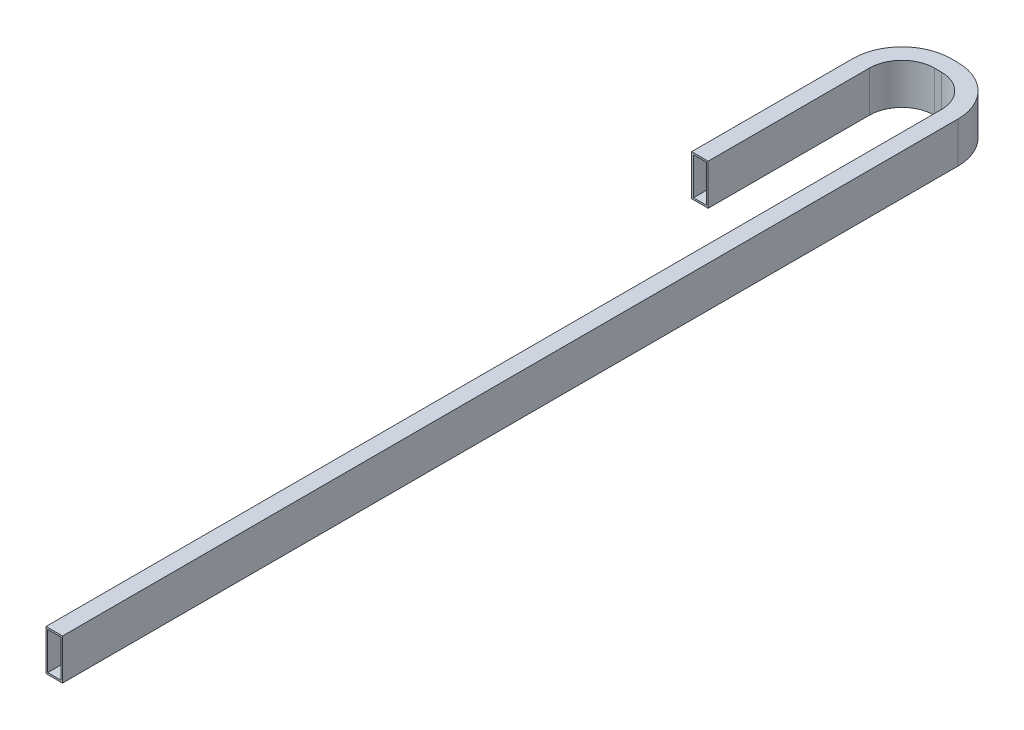
ISO-10303-21;
HEADER;
FILE_DESCRIPTION(('STEP AP214'),'2;1');
FILE_NAME('part.step','',(''),(''),'','','');
FILE_SCHEMA(('AUTOMOTIVE_DESIGN { 1 0 10303 214 1 1 1 1 }'));
ENDSEC;
DATA;
#1=APPLICATION_CONTEXT('core data for automotive mechanical design processes');
#2=APPLICATION_PROTOCOL_DEFINITION('international standard','automotive_design',2000,#1);
#3=PRODUCT_CONTEXT('',#1,'mechanical');
#4=PRODUCT('Part','Part','',(#3));
#5=PRODUCT_RELATED_PRODUCT_CATEGORY('part','',(#4));
#6=PRODUCT_DEFINITION_FORMATION('','',#4);
#7=PRODUCT_DEFINITION_CONTEXT('part definition',#1,'design');
#8=PRODUCT_DEFINITION('design','',#6,#7);
#9=PRODUCT_DEFINITION_SHAPE('','',#8);
#10=(LENGTH_UNIT() NAMED_UNIT(*) SI_UNIT(.MILLI.,.METRE.));
#11=(NAMED_UNIT(*) PLANE_ANGLE_UNIT() SI_UNIT($,.RADIAN.));
#12=(NAMED_UNIT(*) SI_UNIT($,.STERADIAN.) SOLID_ANGLE_UNIT());
#13=UNCERTAINTY_MEASURE_WITH_UNIT(LENGTH_MEASURE(1.E-05),#10,'distance_accuracy_value','');
#14=(GEOMETRIC_REPRESENTATION_CONTEXT(3) GLOBAL_UNCERTAINTY_ASSIGNED_CONTEXT((#13)) GLOBAL_UNIT_ASSIGNED_CONTEXT((#10,
#11,#12)) REPRESENTATION_CONTEXT('',''));
#15=CARTESIAN_POINT('',(0.,0.,0.));
#16=DIRECTION('',(0.,0.,1.));
#17=DIRECTION('',(1.,0.,0.));
#18=AXIS2_PLACEMENT_3D('',#15,#16,#17);
#19=CARTESIAN_POINT('',(6.34999999999999,106.934,-12.7));
#20=DIRECTION('',(-1.,0.,0.));
#21=DIRECTION('',(0.,-1.,0.));
#22=AXIS2_PLACEMENT_3D('',#19,#20,#21);
#23=PLANE('',#22);
#24=DIRECTION('',(0.,-1.,0.));
#25=VECTOR('',#24,1.);
#26=CARTESIAN_POINT('',(6.34999999999999,106.934,0.));
#27=LINE('',#26,#25);
#28=CARTESIAN_POINT('',(6.34999999999999,106.934,0.));
#29=VERTEX_POINT('',#28);
#30=CARTESIAN_POINT('',(6.35,69.8499999999997,0.));
#31=VERTEX_POINT('',#30);
#32=EDGE_CURVE('E378',#29,#31,#27,.T.);
#33=ORIENTED_EDGE('',*,*,#32,.F.);
#34=DIRECTION('',(0.,0.,1.));
#35=VECTOR('',#34,1.);
#36=CARTESIAN_POINT('',(6.34999999999999,106.934,-12.7));
#37=LINE('',#36,#35);
#38=CARTESIAN_POINT('',(6.34999999999999,106.934,-146.513751223267));
#39=VERTEX_POINT('',#38);
#40=EDGE_CURVE('E11',#39,#29,#37,.T.);
#41=ORIENTED_EDGE('',*,*,#40,.F.);
#42=DIRECTION('',(0.,-1.,0.));
#43=VECTOR('',#42,1.);
#44=CARTESIAN_POINT('',(6.34999999999999,106.934,-146.513751223267));
#45=LINE('',#44,#43);
#46=CARTESIAN_POINT('',(6.34999999999999,69.8499999999997,-146.513751223267));
#47=VERTEX_POINT('',#46);
#48=EDGE_CURVE('E331',#39,#47,#45,.T.);
#49=ORIENTED_EDGE('',*,*,#48,.T.);
#50=DIRECTION('',(0.,0.,1.));
#51=VECTOR('',#50,1.);
#52=CARTESIAN_POINT('',(6.35,69.8499999999997,-12.7));
#53=LINE('',#52,#51);
#54=EDGE_CURVE('E35',#47,#31,#53,.T.);
#55=ORIENTED_EDGE('',*,*,#54,.T.);
#56=EDGE_LOOP('',(#33,#41,#49,#55));
#57=FACE_BOUND('',#56,.T.);
#58=ADVANCED_FACE('F32',(#57),#23,.T.);
#59=CARTESIAN_POINT('',(6.34999999999999,106.934,-12.7));
#60=DIRECTION('',(0.,1.,0.));
#61=DIRECTION('',(0.,0.,1.));
#62=AXIS2_PLACEMENT_3D('',#59,#60,#61);
#63=PLANE('',#62);
#64=DIRECTION('',(-1.,0.,0.));
#65=VECTOR('',#64,1.);
#66=CARTESIAN_POINT('',(6.34999999999999,106.934,0.));
#67=LINE('',#66,#65);
#68=CARTESIAN_POINT('',(21.336,106.934,0.));
#69=VERTEX_POINT('',#68);
#70=EDGE_CURVE('E392',#69,#29,#67,.T.);
#71=ORIENTED_EDGE('',*,*,#70,.F.);
#72=DIRECTION('',(0.,0.,1.));
#73=VECTOR('',#72,1.);
#74=CARTESIAN_POINT('',(21.336,106.934,-12.7));
#75=LINE('',#74,#73);
#76=CARTESIAN_POINT('',(21.336,106.934,-146.513751223267));
#77=VERTEX_POINT('',#76);
#78=EDGE_CURVE('E40',#77,#69,#75,.T.);
#79=ORIENTED_EDGE('',*,*,#78,.F.);
#80=CARTESIAN_POINT('',(50.8,106.934,-146.513751223267));
#81=DIRECTION('',(0.,1.,0.));
#82=DIRECTION('',(-1.,0.,0.));
#83=AXIS2_PLACEMENT_3D('',#80,#81,#82);
#84=CIRCLE('',#83,29.464);
#85=CARTESIAN_POINT('',(50.8,106.934,-175.977751223267));
#86=VERTEX_POINT('',#85);
#87=EDGE_CURVE('E347',#86,#77,#84,.T.);
#88=ORIENTED_EDGE('',*,*,#87,.F.);
#89=DIRECTION('',(-1.,0.,0.));
#90=VECTOR('',#89,1.);
#91=CARTESIAN_POINT('',(57.15,106.934,-175.977751223267));
#92=LINE('',#91,#90);
#93=CARTESIAN_POINT('',(57.15,106.934,-175.977751223267));
#94=VERTEX_POINT('',#93);
#95=EDGE_CURVE('E312',#94,#86,#92,.T.);
#96=ORIENTED_EDGE('',*,*,#95,.F.);
#97=CARTESIAN_POINT('',(57.15,106.934,-146.513751223267));
#98=DIRECTION('',(0.,1.,0.));
#99=DIRECTION('',(-1.,0.,0.));
#100=AXIS2_PLACEMENT_3D('',#97,#98,#99);
#101=CIRCLE('',#100,29.464);
#102=CARTESIAN_POINT('',(86.614,106.934,-146.513751223267));
#103=VERTEX_POINT('',#102);
#104=EDGE_CURVE('E277',#103,#94,#101,.T.);
#105=ORIENTED_EDGE('',*,*,#104,.F.);
#106=DIRECTION('',(0.,0.,1.));
#107=VECTOR('',#106,1.);
#108=CARTESIAN_POINT('',(86.614,106.934,-146.513751223267));
#109=LINE('',#108,#107);
#110=CARTESIAN_POINT('',(86.614,106.934,666.75));
#111=VERTEX_POINT('',#110);
#112=EDGE_CURVE('E256',#103,#111,#109,.T.);
#113=ORIENTED_EDGE('',*,*,#112,.T.);
#114=DIRECTION('',(-1.,0.,0.));
#115=VECTOR('',#114,1.);
#116=CARTESIAN_POINT('',(101.6,106.934,666.75));
#117=LINE('',#116,#115);
#118=CARTESIAN_POINT('',(101.6,106.934,666.75));
#119=VERTEX_POINT('',#118);
#120=EDGE_CURVE('E229',#119,#111,#117,.T.);
#121=ORIENTED_EDGE('',*,*,#120,.F.);
#122=DIRECTION('',(0.,0.,1.));
#123=VECTOR('',#122,1.);
#124=CARTESIAN_POINT('',(101.6,106.934,-146.513751223267));
#125=LINE('',#124,#123);
#126=CARTESIAN_POINT('',(101.6,106.934,-146.513751223267));
#127=VERTEX_POINT('',#126);
#128=EDGE_CURVE('E247',#127,#119,#125,.T.);
#129=ORIENTED_EDGE('',*,*,#128,.F.);
#130=CARTESIAN_POINT('',(57.15,106.934,-146.513751223267));
#131=DIRECTION('',(0.,1.,0.));
#132=DIRECTION('',(-1.,0.,0.));
#133=AXIS2_PLACEMENT_3D('',#130,#131,#132);
#134=CIRCLE('',#133,44.45);
#135=CARTESIAN_POINT('',(57.15,106.934,-190.963751223267));
#136=VERTEX_POINT('',#135);
#137=EDGE_CURVE('E266',#127,#136,#134,.T.);
#138=ORIENTED_EDGE('',*,*,#137,.T.);
#139=DIRECTION('',(-1.,0.,0.));
#140=VECTOR('',#139,1.);
#141=CARTESIAN_POINT('',(57.15,106.934,-190.963751223267));
#142=LINE('',#141,#140);
#143=CARTESIAN_POINT('',(50.8,106.934,-190.963751223267));
#144=VERTEX_POINT('',#143);
#145=EDGE_CURVE('E301',#136,#144,#142,.T.);
#146=ORIENTED_EDGE('',*,*,#145,.T.);
#147=CARTESIAN_POINT('',(50.8,106.934,-146.513751223267));
#148=DIRECTION('',(0.,1.,0.));
#149=DIRECTION('',(-1.,0.,0.));
#150=AXIS2_PLACEMENT_3D('',#147,#148,#149);
#151=CIRCLE('',#150,44.45);
#152=EDGE_CURVE('E337',#144,#39,#151,.T.);
#153=ORIENTED_EDGE('',*,*,#152,.T.);
#154=ORIENTED_EDGE('',*,*,#40,.T.);
#155=EDGE_LOOP('',(#71,#79,#88,#96,#105,#113,#121,#129,#138,#146,#153,#154));
#156=FACE_BOUND('',#155,.T.);
#157=ADVANCED_FACE('F404',(#156),#63,.T.);
#158=CARTESIAN_POINT('',(21.336,106.934,-12.7));
#159=DIRECTION('',(1.,0.,0.));
#160=DIRECTION('',(0.,1.,0.));
#161=AXIS2_PLACEMENT_3D('',#158,#159,#160);
#162=PLANE('',#161);
#163=DIRECTION('',(0.,1.,0.));
#164=VECTOR('',#163,1.);
#165=CARTESIAN_POINT('',(21.336,106.934,0.));
#166=LINE('',#165,#164);
#167=CARTESIAN_POINT('',(21.336,69.8499999999997,0.));
#168=VERTEX_POINT('',#167);
#169=EDGE_CURVE('E389',#168,#69,#166,.T.);
#170=ORIENTED_EDGE('',*,*,#169,.F.);
#171=DIRECTION('',(0.,0.,1.));
#172=VECTOR('',#171,1.);
#173=CARTESIAN_POINT('',(21.336,69.8499999999997,-12.7));
#174=LINE('',#173,#172);
#175=CARTESIAN_POINT('',(21.336,69.8499999999997,-146.513751223267));
#176=VERTEX_POINT('',#175);
#177=EDGE_CURVE('E395',#176,#168,#174,.T.);
#178=ORIENTED_EDGE('',*,*,#177,.F.);
#179=DIRECTION('',(0.,1.,0.));
#180=VECTOR('',#179,1.);
#181=CARTESIAN_POINT('',(21.336,69.8499999999997,-146.513751223267));
#182=LINE('',#181,#180);
#183=EDGE_CURVE('E334',#176,#77,#182,.T.);
#184=ORIENTED_EDGE('',*,*,#183,.T.);
#185=ORIENTED_EDGE('',*,*,#78,.T.);
#186=EDGE_LOOP('',(#170,#178,#184,#185));
#187=FACE_BOUND('',#186,.T.);
#188=ADVANCED_FACE('F407',(#187),#162,.T.);
#189=CARTESIAN_POINT('',(6.35,69.8499999999997,-12.7));
#190=DIRECTION('',(0.,-1.,0.));
#191=DIRECTION('',(0.,0.,-1.));
#192=AXIS2_PLACEMENT_3D('',#189,#190,#191);
#193=PLANE('',#192);
#194=DIRECTION('',(1.,0.,0.));
#195=VECTOR('',#194,1.);
#196=CARTESIAN_POINT('',(6.35,69.8499999999997,0.));
#197=LINE('',#196,#195);
#198=EDGE_CURVE('E386',#31,#168,#197,.T.);
#199=ORIENTED_EDGE('',*,*,#198,.F.);
#200=ORIENTED_EDGE('',*,*,#54,.F.);
#201=CARTESIAN_POINT('',(50.8,69.8499999999997,-146.513751223267));
#202=DIRECTION('',(0.,1.,0.));
#203=DIRECTION('',(-1.,0.,0.));
#204=AXIS2_PLACEMENT_3D('',#201,#202,#203);
#205=CIRCLE('',#204,44.45);
#206=CARTESIAN_POINT('',(50.8,69.8499999999997,-190.963751223267));
#207=VERTEX_POINT('',#206);
#208=EDGE_CURVE('E342',#207,#47,#205,.T.);
#209=ORIENTED_EDGE('',*,*,#208,.F.);
#210=DIRECTION('',(-1.,0.,0.));
#211=VECTOR('',#210,1.);
#212=CARTESIAN_POINT('',(57.15,69.8499999999997,-190.963751223267));
#213=LINE('',#212,#211);
#214=CARTESIAN_POINT('',(57.15,69.8499999999997,-190.963751223267));
#215=VERTEX_POINT('',#214);
#216=EDGE_CURVE('E306',#215,#207,#213,.T.);
#217=ORIENTED_EDGE('',*,*,#216,.F.);
#218=CARTESIAN_POINT('',(57.15,69.8499999999997,-146.513751223267));
#219=DIRECTION('',(0.,1.,0.));
#220=DIRECTION('',(-1.,0.,0.));
#221=AXIS2_PLACEMENT_3D('',#218,#219,#220);
#222=CIRCLE('',#221,44.45);
#223=CARTESIAN_POINT('',(101.6,69.8499999999997,-146.513751223267));
#224=VERTEX_POINT('',#223);
#225=EDGE_CURVE('E271',#224,#215,#222,.T.);
#226=ORIENTED_EDGE('',*,*,#225,.F.);
#227=DIRECTION('',(0.,0.,1.));
#228=VECTOR('',#227,1.);
#229=CARTESIAN_POINT('',(101.6,69.8499999999997,-146.513751223267));
#230=LINE('',#229,#228);
#231=CARTESIAN_POINT('',(101.6,69.8499999999997,666.75));
#232=VERTEX_POINT('',#231);
#233=EDGE_CURVE('E206',#224,#232,#230,.T.);
#234=ORIENTED_EDGE('',*,*,#233,.T.);
#235=DIRECTION('',(1.,0.,0.));
#236=VECTOR('',#235,1.);
#237=CARTESIAN_POINT('',(101.6,69.8499999999997,666.75));
#238=LINE('',#237,#236);
#239=CARTESIAN_POINT('',(86.614,69.8499999999997,666.75));
#240=VERTEX_POINT('',#239);
#241=EDGE_CURVE('E235',#240,#232,#238,.T.);
#242=ORIENTED_EDGE('',*,*,#241,.F.);
#243=DIRECTION('',(0.,0.,1.));
#244=VECTOR('',#243,1.);
#245=CARTESIAN_POINT('',(86.614,69.8499999999997,-146.513751223267));
#246=LINE('',#245,#244);
#247=CARTESIAN_POINT('',(86.614,69.8499999999997,-146.513751223267));
#248=VERTEX_POINT('',#247);
#249=EDGE_CURVE('E258',#248,#240,#246,.T.);
#250=ORIENTED_EDGE('',*,*,#249,.F.);
#251=CARTESIAN_POINT('',(57.15,69.8499999999997,-146.513751223267));
#252=DIRECTION('',(0.,1.,0.));
#253=DIRECTION('',(-1.,0.,0.));
#254=AXIS2_PLACEMENT_3D('',#251,#252,#253);
#255=CIRCLE('',#254,29.464);
#256=CARTESIAN_POINT('',(57.15,69.8499999999997,-175.977751223267));
#257=VERTEX_POINT('',#256);
#258=EDGE_CURVE('E280',#248,#257,#255,.T.);
#259=ORIENTED_EDGE('',*,*,#258,.T.);
#260=DIRECTION('',(-1.,0.,0.));
#261=VECTOR('',#260,1.);
#262=CARTESIAN_POINT('',(57.15,69.8499999999997,-175.977751223267));
#263=LINE('',#262,#261);
#264=CARTESIAN_POINT('',(50.8,69.8499999999997,-175.977751223267));
#265=VERTEX_POINT('',#264);
#266=EDGE_CURVE('E315',#257,#265,#263,.T.);
#267=ORIENTED_EDGE('',*,*,#266,.T.);
#268=CARTESIAN_POINT('',(50.8,69.8499999999997,-146.513751223267));
#269=DIRECTION('',(0.,1.,0.));
#270=DIRECTION('',(-1.,0.,0.));
#271=AXIS2_PLACEMENT_3D('',#268,#269,#270);
#272=CIRCLE('',#271,29.464);
#273=EDGE_CURVE('E350',#265,#176,#272,.T.);
#274=ORIENTED_EDGE('',*,*,#273,.T.);
#275=ORIENTED_EDGE('',*,*,#177,.T.);
#276=EDGE_LOOP('',(#199,#200,#209,#217,#226,#234,#242,#250,#259,#267,#274,#275));
#277=FACE_BOUND('',#276,.T.);
#278=ADVANCED_FACE('F401',(#277),#193,.T.);
#279=CARTESIAN_POINT('',(6.35,69.8499999999997,0.));
#280=DIRECTION('',(0.,0.,1.));
#281=DIRECTION('',(1.,0.,0.));
#282=AXIS2_PLACEMENT_3D('',#279,#280,#281);
#283=PLANE('',#282);
#284=DIRECTION('',(0.,-1.,0.));
#285=VECTOR('',#284,1.);
#286=CARTESIAN_POINT('',(7.93749999999999,105.3465,0.));
#287=LINE('',#286,#285);
#288=CARTESIAN_POINT('',(7.93749999999999,105.3465,0.));
#289=VERTEX_POINT('',#288);
#290=CARTESIAN_POINT('',(7.9375,71.4374999999997,0.));
#291=VERTEX_POINT('',#290);
#292=EDGE_CURVE('E48',#289,#291,#287,.T.);
#293=ORIENTED_EDGE('',*,*,#292,.F.);
#294=DIRECTION('',(-1.,0.,0.));
#295=VECTOR('',#294,1.);
#296=CARTESIAN_POINT('',(7.93749999999999,105.3465,0.));
#297=LINE('',#296,#295);
#298=CARTESIAN_POINT('',(19.7485,105.3465,0.));
#299=VERTEX_POINT('',#298);
#300=EDGE_CURVE('E373',#299,#289,#297,.T.);
#301=ORIENTED_EDGE('',*,*,#300,.F.);
#302=DIRECTION('',(0.,1.,0.));
#303=VECTOR('',#302,1.);
#304=CARTESIAN_POINT('',(19.7485,105.3465,0.));
#305=LINE('',#304,#303);
#306=CARTESIAN_POINT('',(19.7485,71.4374999999997,0.));
#307=VERTEX_POINT('',#306);
#308=EDGE_CURVE('E370',#307,#299,#305,.T.);
#309=ORIENTED_EDGE('',*,*,#308,.F.);
#310=DIRECTION('',(1.,0.,0.));
#311=VECTOR('',#310,1.);
#312=CARTESIAN_POINT('',(7.9375,71.4374999999997,0.));
#313=LINE('',#312,#311);
#314=EDGE_CURVE('E367',#291,#307,#313,.T.);
#315=ORIENTED_EDGE('',*,*,#314,.F.);
#316=EDGE_LOOP('',(#293,#301,#309,#315));
#317=FACE_BOUND('',#316,.T.);
#318=ORIENTED_EDGE('',*,*,#32,.T.);
#319=ORIENTED_EDGE('',*,*,#198,.T.);
#320=ORIENTED_EDGE('',*,*,#169,.T.);
#321=ORIENTED_EDGE('',*,*,#70,.T.);
#322=EDGE_LOOP('',(#318,#319,#320,#321));
#323=FACE_BOUND('',#322,.T.);
#324=ADVANCED_FACE('F403',(#317,#323),#283,.T.);
#325=CARTESIAN_POINT('',(7.93749999999999,105.3465,-12.7));
#326=DIRECTION('',(-1.,0.,0.));
#327=DIRECTION('',(0.,-1.,0.));
#328=AXIS2_PLACEMENT_3D('',#325,#326,#327);
#329=PLANE('',#328);
#330=ORIENTED_EDGE('',*,*,#292,.T.);
#331=DIRECTION('',(0.,0.,1.));
#332=VECTOR('',#331,1.);
#333=CARTESIAN_POINT('',(7.9375,71.4374999999997,-12.7));
#334=LINE('',#333,#332);
#335=CARTESIAN_POINT('',(7.93750000000001,71.4374999999997,-146.513751223267));
#336=VERTEX_POINT('',#335);
#337=EDGE_CURVE('E375',#336,#291,#334,.T.);
#338=ORIENTED_EDGE('',*,*,#337,.F.);
#339=DIRECTION('',(0.,-1.,0.));
#340=VECTOR('',#339,1.);
#341=CARTESIAN_POINT('',(7.93750000000001,105.3465,-146.513751223267));
#342=LINE('',#341,#340);
#343=CARTESIAN_POINT('',(7.93750000000001,105.3465,-146.513751223267));
#344=VERTEX_POINT('',#343);
#345=EDGE_CURVE('E341',#344,#336,#342,.T.);
#346=ORIENTED_EDGE('',*,*,#345,.F.);
#347=DIRECTION('',(0.,0.,1.));
#348=VECTOR('',#347,1.);
#349=CARTESIAN_POINT('',(7.93749999999999,105.3465,-12.7));
#350=LINE('',#349,#348);
#351=EDGE_CURVE('E376',#344,#289,#350,.T.);
#352=ORIENTED_EDGE('',*,*,#351,.T.);
#353=EDGE_LOOP('',(#330,#338,#346,#352));
#354=FACE_BOUND('',#353,.T.);
#355=ADVANCED_FACE('F465',(#354),#329,.F.);
#356=CARTESIAN_POINT('',(7.93749999999999,105.3465,-12.7));
#357=DIRECTION('',(0.,1.,0.));
#358=DIRECTION('',(0.,0.,1.));
#359=AXIS2_PLACEMENT_3D('',#356,#357,#358);
#360=PLANE('',#359);
#361=ORIENTED_EDGE('',*,*,#300,.T.);
#362=ORIENTED_EDGE('',*,*,#351,.F.);
#363=CARTESIAN_POINT('',(50.8,105.3465,-146.513751223267));
#364=DIRECTION('',(0.,1.,0.));
#365=DIRECTION('',(-1.,0.,0.));
#366=AXIS2_PLACEMENT_3D('',#363,#364,#365);
#367=CIRCLE('',#366,42.8625);
#368=CARTESIAN_POINT('',(50.8,105.3465,-189.376251223267));
#369=VERTEX_POINT('',#368);
#370=EDGE_CURVE('E357',#369,#344,#367,.T.);
#371=ORIENTED_EDGE('',*,*,#370,.F.);
#372=DIRECTION('',(-1.,0.,0.));
#373=VECTOR('',#372,1.);
#374=CARTESIAN_POINT('',(57.15,105.3465,-189.376251223267));
#375=LINE('',#374,#373);
#376=CARTESIAN_POINT('',(57.15,105.3465,-189.376251223267));
#377=VERTEX_POINT('',#376);
#378=EDGE_CURVE('E322',#377,#369,#375,.T.);
#379=ORIENTED_EDGE('',*,*,#378,.F.);
#380=CARTESIAN_POINT('',(57.15,105.3465,-146.513751223267));
#381=DIRECTION('',(0.,1.,0.));
#382=DIRECTION('',(-1.,0.,0.));
#383=AXIS2_PLACEMENT_3D('',#380,#381,#382);
#384=CIRCLE('',#383,42.8625);
#385=CARTESIAN_POINT('',(100.0125,105.3465,-146.513751223267));
#386=VERTEX_POINT('',#385);
#387=EDGE_CURVE('E286',#386,#377,#384,.T.);
#388=ORIENTED_EDGE('',*,*,#387,.F.);
#389=DIRECTION('',(0.,0.,1.));
#390=VECTOR('',#389,1.);
#391=CARTESIAN_POINT('',(100.0125,105.3465,-146.513751223267));
#392=LINE('',#391,#390);
#393=CARTESIAN_POINT('',(100.0125,105.3465,666.75));
#394=VERTEX_POINT('',#393);
#395=EDGE_CURVE('E205',#386,#394,#392,.T.);
#396=ORIENTED_EDGE('',*,*,#395,.T.);
#397=DIRECTION('',(-1.,0.,0.));
#398=VECTOR('',#397,1.);
#399=CARTESIAN_POINT('',(100.0125,105.3465,666.75));
#400=LINE('',#399,#398);
#401=CARTESIAN_POINT('',(88.2015,105.3465,666.75));
#402=VERTEX_POINT('',#401);
#403=EDGE_CURVE('E209',#394,#402,#400,.T.);
#404=ORIENTED_EDGE('',*,*,#403,.T.);
#405=DIRECTION('',(0.,0.,1.));
#406=VECTOR('',#405,1.);
#407=CARTESIAN_POINT('',(88.2015,105.3465,-146.513751223267));
#408=LINE('',#407,#406);
#409=CARTESIAN_POINT('',(88.2015,105.3465,-146.513751223267));
#410=VERTEX_POINT('',#409);
#411=EDGE_CURVE('E194',#410,#402,#408,.T.);
#412=ORIENTED_EDGE('',*,*,#411,.F.);
#413=CARTESIAN_POINT('',(57.15,105.3465,-146.513751223267));
#414=DIRECTION('',(0.,1.,0.));
#415=DIRECTION('',(-1.,0.,0.));
#416=AXIS2_PLACEMENT_3D('',#413,#414,#415);
#417=CIRCLE('',#416,31.0515);
#418=CARTESIAN_POINT('',(57.15,105.3465,-177.565251223267));
#419=VERTEX_POINT('',#418);
#420=EDGE_CURVE('E274',#410,#419,#417,.T.);
#421=ORIENTED_EDGE('',*,*,#420,.T.);
#422=DIRECTION('',(-1.,0.,0.));
#423=VECTOR('',#422,1.);
#424=CARTESIAN_POINT('',(57.15,105.3465,-177.565251223267));
#425=LINE('',#424,#423);
#426=CARTESIAN_POINT('',(50.8,105.3465,-177.565251223267));
#427=VERTEX_POINT('',#426);
#428=EDGE_CURVE('E309',#419,#427,#425,.T.);
#429=ORIENTED_EDGE('',*,*,#428,.T.);
#430=CARTESIAN_POINT('',(50.8,105.3465,-146.513751223267));
#431=DIRECTION('',(0.,1.,0.));
#432=DIRECTION('',(-1.,0.,0.));
#433=AXIS2_PLACEMENT_3D('',#430,#431,#432);
#434=CIRCLE('',#433,31.0515);
#435=CARTESIAN_POINT('',(19.7485,105.3465,-146.513751223267));
#436=VERTEX_POINT('',#435);
#437=EDGE_CURVE('E345',#427,#436,#434,.T.);
#438=ORIENTED_EDGE('',*,*,#437,.T.);
#439=DIRECTION('',(0.,0.,1.));
#440=VECTOR('',#439,1.);
#441=CARTESIAN_POINT('',(19.7485,105.3465,-12.7));
#442=LINE('',#441,#440);
#443=EDGE_CURVE('E379',#436,#299,#442,.T.);
#444=ORIENTED_EDGE('',*,*,#443,.T.);
#445=EDGE_LOOP('',(#361,#362,#371,#379,#388,#396,#404,#412,#421,#429,#438,#444));
#446=FACE_BOUND('',#445,.T.);
#447=ADVANCED_FACE('F211',(#446),#360,.F.);
#448=CARTESIAN_POINT('',(19.7485,105.3465,-12.7));
#449=DIRECTION('',(1.,0.,0.));
#450=DIRECTION('',(0.,1.,0.));
#451=AXIS2_PLACEMENT_3D('',#448,#449,#450);
#452=PLANE('',#451);
#453=ORIENTED_EDGE('',*,*,#308,.T.);
#454=ORIENTED_EDGE('',*,*,#443,.F.);
#455=DIRECTION('',(0.,1.,0.));
#456=VECTOR('',#455,1.);
#457=CARTESIAN_POINT('',(19.7485,71.4374999999997,-146.513751223267));
#458=LINE('',#457,#456);
#459=CARTESIAN_POINT('',(19.7485,71.4374999999997,-146.513751223267));
#460=VERTEX_POINT('',#459);
#461=EDGE_CURVE('E338',#460,#436,#458,.T.);
#462=ORIENTED_EDGE('',*,*,#461,.F.);
#463=DIRECTION('',(0.,0.,1.));
#464=VECTOR('',#463,1.);
#465=CARTESIAN_POINT('',(19.7485,71.4374999999997,-12.7));
#466=LINE('',#465,#464);
#467=EDGE_CURVE('E381',#460,#307,#466,.T.);
#468=ORIENTED_EDGE('',*,*,#467,.T.);
#469=EDGE_LOOP('',(#453,#454,#462,#468));
#470=FACE_BOUND('',#469,.T.);
#471=ADVANCED_FACE('F482',(#470),#452,.F.);
#472=CARTESIAN_POINT('',(7.9375,71.4374999999997,-12.7));
#473=DIRECTION('',(0.,-1.,0.));
#474=DIRECTION('',(0.,0.,-1.));
#475=AXIS2_PLACEMENT_3D('',#472,#473,#474);
#476=PLANE('',#475);
#477=ORIENTED_EDGE('',*,*,#314,.T.);
#478=ORIENTED_EDGE('',*,*,#467,.F.);
#479=CARTESIAN_POINT('',(50.8,71.4374999999997,-146.513751223267));
#480=DIRECTION('',(0.,1.,0.));
#481=DIRECTION('',(-1.,0.,0.));
#482=AXIS2_PLACEMENT_3D('',#479,#480,#481);
#483=CIRCLE('',#482,31.0515);
#484=CARTESIAN_POINT('',(50.8,71.4374999999997,-177.565251223267));
#485=VERTEX_POINT('',#484);
#486=EDGE_CURVE('E363',#485,#460,#483,.T.);
#487=ORIENTED_EDGE('',*,*,#486,.F.);
#488=DIRECTION('',(-1.,0.,0.));
#489=VECTOR('',#488,1.);
#490=CARTESIAN_POINT('',(57.15,71.4374999999997,-177.565251223267));
#491=LINE('',#490,#489);
#492=CARTESIAN_POINT('',(57.15,71.4374999999997,-177.565251223267));
#493=VERTEX_POINT('',#492);
#494=EDGE_CURVE('E328',#493,#485,#491,.T.);
#495=ORIENTED_EDGE('',*,*,#494,.F.);
#496=CARTESIAN_POINT('',(57.15,71.4374999999997,-146.513751223267));
#497=DIRECTION('',(0.,1.,0.));
#498=DIRECTION('',(-1.,0.,0.));
#499=AXIS2_PLACEMENT_3D('',#496,#497,#498);
#500=CIRCLE('',#499,31.0515);
#501=CARTESIAN_POINT('',(88.2015,71.4374999999997,-146.513751223267));
#502=VERTEX_POINT('',#501);
#503=EDGE_CURVE('E292',#502,#493,#500,.T.);
#504=ORIENTED_EDGE('',*,*,#503,.F.);
#505=DIRECTION('',(0.,0.,1.));
#506=VECTOR('',#505,1.);
#507=CARTESIAN_POINT('',(88.2015,71.4374999999997,-146.513751223267));
#508=LINE('',#507,#506);
#509=CARTESIAN_POINT('',(88.2015,71.4374999999997,666.75));
#510=VERTEX_POINT('',#509);
#511=EDGE_CURVE('E252',#502,#510,#508,.T.);
#512=ORIENTED_EDGE('',*,*,#511,.T.);
#513=DIRECTION('',(1.,0.,0.));
#514=VECTOR('',#513,1.);
#515=CARTESIAN_POINT('',(100.0125,71.4374999999997,666.75));
#516=LINE('',#515,#514);
#517=CARTESIAN_POINT('',(100.0125,71.4374999999997,666.75));
#518=VERTEX_POINT('',#517);
#519=EDGE_CURVE('E221',#510,#518,#516,.T.);
#520=ORIENTED_EDGE('',*,*,#519,.T.);
#521=DIRECTION('',(0.,0.,1.));
#522=VECTOR('',#521,1.);
#523=CARTESIAN_POINT('',(100.0125,71.4374999999997,-146.513751223267));
#524=LINE('',#523,#522);
#525=CARTESIAN_POINT('',(100.0125,71.4374999999997,-146.513751223267));
#526=VERTEX_POINT('',#525);
#527=EDGE_CURVE('E250',#526,#518,#524,.T.);
#528=ORIENTED_EDGE('',*,*,#527,.F.);
#529=CARTESIAN_POINT('',(57.15,71.4374999999997,-146.513751223267));
#530=DIRECTION('',(0.,1.,0.));
#531=DIRECTION('',(-1.,0.,0.));
#532=AXIS2_PLACEMENT_3D('',#529,#530,#531);
#533=CIRCLE('',#532,42.8625);
#534=CARTESIAN_POINT('',(57.15,71.4374999999997,-189.376251223267));
#535=VERTEX_POINT('',#534);
#536=EDGE_CURVE('E289',#526,#535,#533,.T.);
#537=ORIENTED_EDGE('',*,*,#536,.T.);
#538=DIRECTION('',(-1.,0.,0.));
#539=VECTOR('',#538,1.);
#540=CARTESIAN_POINT('',(57.15,71.4374999999997,-189.376251223267));
#541=LINE('',#540,#539);
#542=CARTESIAN_POINT('',(50.8,71.4374999999997,-189.376251223267));
#543=VERTEX_POINT('',#542);
#544=EDGE_CURVE('E325',#535,#543,#541,.T.);
#545=ORIENTED_EDGE('',*,*,#544,.T.);
#546=CARTESIAN_POINT('',(50.8,71.4374999999997,-146.513751223267));
#547=DIRECTION('',(0.,1.,0.));
#548=DIRECTION('',(-1.,0.,0.));
#549=AXIS2_PLACEMENT_3D('',#546,#547,#548);
#550=CIRCLE('',#549,42.8625);
#551=EDGE_CURVE('E360',#543,#336,#550,.T.);
#552=ORIENTED_EDGE('',*,*,#551,.T.);
#553=ORIENTED_EDGE('',*,*,#337,.T.);
#554=EDGE_LOOP('',(#477,#478,#487,#495,#504,#512,#520,#528,#537,#545,#552,#553));
#555=FACE_BOUND('',#554,.T.);
#556=ADVANCED_FACE('F474',(#555),#476,.F.);
#557=CARTESIAN_POINT('',(50.8,69.8499999999997,-146.513751223267));
#558=DIRECTION('',(0.,1.,0.));
#559=DIRECTION('',(-1.,0.,0.));
#560=AXIS2_PLACEMENT_3D('',#557,#558,#559);
#561=CYLINDRICAL_SURFACE('',#560,42.8625);
#562=DIRECTION('',(0.,-1.,0.));
#563=VECTOR('',#562,1.);
#564=CARTESIAN_POINT('',(50.8,105.3465,-189.376251223267));
#565=LINE('',#564,#563);
#566=EDGE_CURVE('E305',#369,#543,#565,.T.);
#567=ORIENTED_EDGE('',*,*,#566,.F.);
#568=ORIENTED_EDGE('',*,*,#370,.T.);
#569=ORIENTED_EDGE('',*,*,#345,.T.);
#570=ORIENTED_EDGE('',*,*,#551,.F.);
#571=EDGE_LOOP('',(#567,#568,#569,#570));
#572=FACE_BOUND('',#571,.T.);
#573=ADVANCED_FACE('F479',(#572),#561,.F.);
#574=CARTESIAN_POINT('',(50.8,69.8499999999997,-146.513751223267));
#575=DIRECTION('',(0.,1.,0.));
#576=DIRECTION('',(-1.,0.,0.));
#577=AXIS2_PLACEMENT_3D('',#574,#575,#576);
#578=CYLINDRICAL_SURFACE('',#577,31.0515);
#579=DIRECTION('',(0.,1.,0.));
#580=VECTOR('',#579,1.);
#581=CARTESIAN_POINT('',(50.8,71.4374999999997,-177.565251223267));
#582=LINE('',#581,#580);
#583=EDGE_CURVE('E302',#485,#427,#582,.T.);
#584=ORIENTED_EDGE('',*,*,#583,.F.);
#585=ORIENTED_EDGE('',*,*,#486,.T.);
#586=ORIENTED_EDGE('',*,*,#461,.T.);
#587=ORIENTED_EDGE('',*,*,#437,.F.);
#588=EDGE_LOOP('',(#584,#585,#586,#587));
#589=FACE_BOUND('',#588,.T.);
#590=ADVANCED_FACE('F448',(#589),#578,.T.);
#591=CARTESIAN_POINT('',(50.8,69.8499999999997,-146.513751223267));
#592=DIRECTION('',(0.,1.,0.));
#593=DIRECTION('',(-1.,0.,0.));
#594=AXIS2_PLACEMENT_3D('',#591,#592,#593);
#595=CYLINDRICAL_SURFACE('',#594,29.464);
#596=DIRECTION('',(0.,1.,0.));
#597=VECTOR('',#596,1.);
#598=CARTESIAN_POINT('',(50.8,69.8499999999997,-175.977751223267));
#599=LINE('',#598,#597);
#600=EDGE_CURVE('E298',#265,#86,#599,.T.);
#601=ORIENTED_EDGE('',*,*,#600,.T.);
#602=ORIENTED_EDGE('',*,*,#87,.T.);
#603=ORIENTED_EDGE('',*,*,#183,.F.);
#604=ORIENTED_EDGE('',*,*,#273,.F.);
#605=EDGE_LOOP('',(#601,#602,#603,#604));
#606=FACE_BOUND('',#605,.T.);
#607=ADVANCED_FACE('F409',(#606),#595,.F.);
#608=CARTESIAN_POINT('',(50.8,69.8499999999997,-146.513751223267));
#609=DIRECTION('',(0.,1.,0.));
#610=DIRECTION('',(-1.,0.,0.));
#611=AXIS2_PLACEMENT_3D('',#608,#609,#610);
#612=CYLINDRICAL_SURFACE('',#611,44.45);
#613=DIRECTION('',(0.,-1.,0.));
#614=VECTOR('',#613,1.);
#615=CARTESIAN_POINT('',(50.8,106.934,-190.963751223267));
#616=LINE('',#615,#614);
#617=EDGE_CURVE('E295',#144,#207,#616,.T.);
#618=ORIENTED_EDGE('',*,*,#617,.T.);
#619=ORIENTED_EDGE('',*,*,#208,.T.);
#620=ORIENTED_EDGE('',*,*,#48,.F.);
#621=ORIENTED_EDGE('',*,*,#152,.F.);
#622=EDGE_LOOP('',(#618,#619,#620,#621));
#623=FACE_BOUND('',#622,.T.);
#624=ADVANCED_FACE('F437',(#623),#612,.T.);
#625=CARTESIAN_POINT('',(57.15,105.3465,-189.376251223267));
#626=DIRECTION('',(0.,0.,-1.));
#627=DIRECTION('',(0.,1.,0.));
#628=AXIS2_PLACEMENT_3D('',#625,#626,#627);
#629=PLANE('',#628);
#630=DIRECTION('',(0.,-1.,0.));
#631=VECTOR('',#630,1.);
#632=CARTESIAN_POINT('',(57.15,105.3465,-189.376251223267));
#633=LINE('',#632,#631);
#634=EDGE_CURVE('E270',#377,#535,#633,.T.);
#635=ORIENTED_EDGE('',*,*,#634,.F.);
#636=ORIENTED_EDGE('',*,*,#378,.T.);
#637=ORIENTED_EDGE('',*,*,#566,.T.);
#638=ORIENTED_EDGE('',*,*,#544,.F.);
#639=EDGE_LOOP('',(#635,#636,#637,#638));
#640=FACE_BOUND('',#639,.T.);
#641=ADVANCED_FACE('F439',(#640),#629,.F.);
#642=CARTESIAN_POINT('',(57.15,71.4374999999997,-177.565251223267));
#643=DIRECTION('',(0.,0.,1.));
#644=DIRECTION('',(0.,-1.,0.));
#645=AXIS2_PLACEMENT_3D('',#642,#643,#644);
#646=PLANE('',#645);
#647=DIRECTION('',(0.,1.,0.));
#648=VECTOR('',#647,1.);
#649=CARTESIAN_POINT('',(57.15,71.4374999999997,-177.565251223267));
#650=LINE('',#649,#648);
#651=EDGE_CURVE('E267',#493,#419,#650,.T.);
#652=ORIENTED_EDGE('',*,*,#651,.F.);
#653=ORIENTED_EDGE('',*,*,#494,.T.);
#654=ORIENTED_EDGE('',*,*,#583,.T.);
#655=ORIENTED_EDGE('',*,*,#428,.F.);
#656=EDGE_LOOP('',(#652,#653,#654,#655));
#657=FACE_BOUND('',#656,.T.);
#658=ADVANCED_FACE('F445',(#657),#646,.F.);
#659=CARTESIAN_POINT('',(57.15,69.8499999999997,-175.977751223267));
#660=DIRECTION('',(0.,0.,1.));
#661=DIRECTION('',(0.,-1.,0.));
#662=AXIS2_PLACEMENT_3D('',#659,#660,#661);
#663=PLANE('',#662);
#664=DIRECTION('',(0.,1.,0.));
#665=VECTOR('',#664,1.);
#666=CARTESIAN_POINT('',(57.15,69.8499999999997,-175.977751223267));
#667=LINE('',#666,#665);
#668=EDGE_CURVE('E263',#257,#94,#667,.T.);
#669=ORIENTED_EDGE('',*,*,#668,.T.);
#670=ORIENTED_EDGE('',*,*,#95,.T.);
#671=ORIENTED_EDGE('',*,*,#600,.F.);
#672=ORIENTED_EDGE('',*,*,#266,.F.);
#673=EDGE_LOOP('',(#669,#670,#671,#672));
#674=FACE_BOUND('',#673,.T.);
#675=ADVANCED_FACE('F412',(#674),#663,.T.);
#676=CARTESIAN_POINT('',(57.15,106.934,-190.963751223267));
#677=DIRECTION('',(0.,0.,-1.));
#678=DIRECTION('',(0.,1.,0.));
#679=AXIS2_PLACEMENT_3D('',#676,#677,#678);
#680=PLANE('',#679);
#681=DIRECTION('',(0.,-1.,0.));
#682=VECTOR('',#681,1.);
#683=CARTESIAN_POINT('',(57.15,106.934,-190.963751223267));
#684=LINE('',#683,#682);
#685=EDGE_CURVE('E254',#136,#215,#684,.T.);
#686=ORIENTED_EDGE('',*,*,#685,.T.);
#687=ORIENTED_EDGE('',*,*,#216,.T.);
#688=ORIENTED_EDGE('',*,*,#617,.F.);
#689=ORIENTED_EDGE('',*,*,#145,.F.);
#690=EDGE_LOOP('',(#686,#687,#688,#689));
#691=FACE_BOUND('',#690,.T.);
#692=ADVANCED_FACE('F434',(#691),#680,.T.);
#693=CARTESIAN_POINT('',(57.15,69.8499999999997,-146.513751223267));
#694=DIRECTION('',(0.,1.,0.));
#695=DIRECTION('',(-1.,0.,0.));
#696=AXIS2_PLACEMENT_3D('',#693,#694,#695);
#697=CYLINDRICAL_SURFACE('',#696,42.8625);
#698=DIRECTION('',(0.,-1.,0.));
#699=VECTOR('',#698,1.);
#700=CARTESIAN_POINT('',(100.0125,105.3465,-146.513751223267));
#701=LINE('',#700,#699);
#702=EDGE_CURVE('E245',#386,#526,#701,.T.);
#703=ORIENTED_EDGE('',*,*,#702,.F.);
#704=ORIENTED_EDGE('',*,*,#387,.T.);
#705=ORIENTED_EDGE('',*,*,#634,.T.);
#706=ORIENTED_EDGE('',*,*,#536,.F.);
#707=EDGE_LOOP('',(#703,#704,#705,#706));
#708=FACE_BOUND('',#707,.T.);
#709=ADVANCED_FACE('F494',(#708),#697,.F.);
#710=CARTESIAN_POINT('',(57.15,69.8499999999997,-146.513751223267));
#711=DIRECTION('',(0.,1.,0.));
#712=DIRECTION('',(-1.,0.,0.));
#713=AXIS2_PLACEMENT_3D('',#710,#711,#712);
#714=CYLINDRICAL_SURFACE('',#713,31.0515);
#715=DIRECTION('',(0.,1.,0.));
#716=VECTOR('',#715,1.);
#717=CARTESIAN_POINT('',(88.2015,71.4374999999997,-146.513751223267));
#718=LINE('',#717,#716);
#719=EDGE_CURVE('E202',#502,#410,#718,.T.);
#720=ORIENTED_EDGE('',*,*,#719,.F.);
#721=ORIENTED_EDGE('',*,*,#503,.T.);
#722=ORIENTED_EDGE('',*,*,#651,.T.);
#723=ORIENTED_EDGE('',*,*,#420,.F.);
#724=EDGE_LOOP('',(#720,#721,#722,#723));
#725=FACE_BOUND('',#724,.T.);
#726=ADVANCED_FACE('F488',(#725),#714,.T.);
#727=CARTESIAN_POINT('',(57.15,69.8499999999997,-146.513751223267));
#728=DIRECTION('',(0.,1.,0.));
#729=DIRECTION('',(-1.,0.,0.));
#730=AXIS2_PLACEMENT_3D('',#727,#728,#729);
#731=CYLINDRICAL_SURFACE('',#730,29.464);
#732=DIRECTION('',(0.,1.,0.));
#733=VECTOR('',#732,1.);
#734=CARTESIAN_POINT('',(86.614,69.8499999999997,-146.513751223267));
#735=LINE('',#734,#733);
#736=EDGE_CURVE('E241',#248,#103,#735,.T.);
#737=ORIENTED_EDGE('',*,*,#736,.T.);
#738=ORIENTED_EDGE('',*,*,#104,.T.);
#739=ORIENTED_EDGE('',*,*,#668,.F.);
#740=ORIENTED_EDGE('',*,*,#258,.F.);
#741=EDGE_LOOP('',(#737,#738,#739,#740));
#742=FACE_BOUND('',#741,.T.);
#743=ADVANCED_FACE('F419',(#742),#731,.F.);
#744=CARTESIAN_POINT('',(57.15,69.8499999999997,-146.513751223267));
#745=DIRECTION('',(0.,1.,0.));
#746=DIRECTION('',(-1.,0.,0.));
#747=AXIS2_PLACEMENT_3D('',#744,#745,#746);
#748=CYLINDRICAL_SURFACE('',#747,44.45);
#749=DIRECTION('',(0.,-1.,0.));
#750=VECTOR('',#749,1.);
#751=CARTESIAN_POINT('',(101.6,106.934,-146.513751223267));
#752=LINE('',#751,#750);
#753=EDGE_CURVE('E238',#127,#224,#752,.T.);
#754=ORIENTED_EDGE('',*,*,#753,.T.);
#755=ORIENTED_EDGE('',*,*,#225,.T.);
#756=ORIENTED_EDGE('',*,*,#685,.F.);
#757=ORIENTED_EDGE('',*,*,#137,.F.);
#758=EDGE_LOOP('',(#754,#755,#756,#757));
#759=FACE_BOUND('',#758,.T.);
#760=ADVANCED_FACE('F431',(#759),#748,.T.);
#761=CARTESIAN_POINT('',(88.2015,71.4374999999997,-146.513751223267));
#762=DIRECTION('',(1.,0.,0.));
#763=DIRECTION('',(0.,0.,-1.));
#764=AXIS2_PLACEMENT_3D('',#761,#762,#763);
#765=PLANE('',#764);
#766=ORIENTED_EDGE('',*,*,#411,.T.);
#767=DIRECTION('',(0.,-1.,0.));
#768=VECTOR('',#767,1.);
#769=CARTESIAN_POINT('',(88.2015,71.4374999999997,666.75));
#770=LINE('',#769,#768);
#771=EDGE_CURVE('E199',#402,#510,#770,.T.);
#772=ORIENTED_EDGE('',*,*,#771,.T.);
#773=ORIENTED_EDGE('',*,*,#511,.F.);
#774=ORIENTED_EDGE('',*,*,#719,.T.);
#775=EDGE_LOOP('',(#766,#772,#773,#774));
#776=FACE_BOUND('',#775,.T.);
#777=ADVANCED_FACE('F196',(#776),#765,.T.);
#778=CARTESIAN_POINT('',(100.0125,105.3465,-146.513751223267));
#779=DIRECTION('',(-1.,0.,0.));
#780=DIRECTION('',(0.,0.,1.));
#781=AXIS2_PLACEMENT_3D('',#778,#779,#780);
#782=PLANE('',#781);
#783=ORIENTED_EDGE('',*,*,#527,.T.);
#784=DIRECTION('',(0.,1.,0.));
#785=VECTOR('',#784,1.);
#786=CARTESIAN_POINT('',(100.0125,71.4374999999997,666.75));
#787=LINE('',#786,#785);
#788=EDGE_CURVE('E216',#518,#394,#787,.T.);
#789=ORIENTED_EDGE('',*,*,#788,.T.);
#790=ORIENTED_EDGE('',*,*,#395,.F.);
#791=ORIENTED_EDGE('',*,*,#702,.T.);
#792=EDGE_LOOP('',(#783,#789,#790,#791));
#793=FACE_BOUND('',#792,.T.);
#794=ADVANCED_FACE('F491',(#793),#782,.T.);
#795=CARTESIAN_POINT('',(101.6,106.934,-146.513751223267));
#796=DIRECTION('',(-1.,0.,0.));
#797=DIRECTION('',(0.,0.,1.));
#798=AXIS2_PLACEMENT_3D('',#795,#796,#797);
#799=PLANE('',#798);
#800=ORIENTED_EDGE('',*,*,#128,.T.);
#801=DIRECTION('',(0.,1.,0.));
#802=VECTOR('',#801,1.);
#803=CARTESIAN_POINT('',(101.6,69.8499999999997,666.75));
#804=LINE('',#803,#802);
#805=EDGE_CURVE('E223',#232,#119,#804,.T.);
#806=ORIENTED_EDGE('',*,*,#805,.F.);
#807=ORIENTED_EDGE('',*,*,#233,.F.);
#808=ORIENTED_EDGE('',*,*,#753,.F.);
#809=EDGE_LOOP('',(#800,#806,#807,#808));
#810=FACE_BOUND('',#809,.T.);
#811=ADVANCED_FACE('F429',(#810),#799,.F.);
#812=CARTESIAN_POINT('',(86.614,69.8499999999997,-146.513751223267));
#813=DIRECTION('',(1.,0.,0.));
#814=DIRECTION('',(0.,0.,-1.));
#815=AXIS2_PLACEMENT_3D('',#812,#813,#814);
#816=PLANE('',#815);
#817=ORIENTED_EDGE('',*,*,#249,.T.);
#818=DIRECTION('',(0.,-1.,0.));
#819=VECTOR('',#818,1.);
#820=CARTESIAN_POINT('',(86.614,69.8499999999997,666.75));
#821=LINE('',#820,#819);
#822=EDGE_CURVE('E232',#111,#240,#821,.T.);
#823=ORIENTED_EDGE('',*,*,#822,.F.);
#824=ORIENTED_EDGE('',*,*,#112,.F.);
#825=ORIENTED_EDGE('',*,*,#736,.F.);
#826=EDGE_LOOP('',(#817,#823,#824,#825));
#827=FACE_BOUND('',#826,.T.);
#828=ADVANCED_FACE('F422',(#827),#816,.F.);
#829=CARTESIAN_POINT('',(101.6,69.8499999999997,666.75));
#830=DIRECTION('',(0.,0.,1.));
#831=DIRECTION('',(1.,0.,0.));
#832=AXIS2_PLACEMENT_3D('',#829,#830,#831);
#833=PLANE('',#832);
#834=ORIENTED_EDGE('',*,*,#788,.F.);
#835=ORIENTED_EDGE('',*,*,#519,.F.);
#836=ORIENTED_EDGE('',*,*,#771,.F.);
#837=ORIENTED_EDGE('',*,*,#403,.F.);
#838=EDGE_LOOP('',(#834,#835,#836,#837));
#839=FACE_BOUND('',#838,.T.);
#840=ORIENTED_EDGE('',*,*,#805,.T.);
#841=ORIENTED_EDGE('',*,*,#120,.T.);
#842=ORIENTED_EDGE('',*,*,#822,.T.);
#843=ORIENTED_EDGE('',*,*,#241,.T.);
#844=EDGE_LOOP('',(#840,#841,#842,#843));
#845=FACE_BOUND('',#844,.T.);
#846=ADVANCED_FACE('F218',(#839,#845),#833,.T.);
#847=CLOSED_SHELL('',(#58,#157,#188,#278,#324,#355,#447,#471,#556,#573,#590,#607,#624,#641,#658,
#675,#692,#709,#726,#743,#760,#777,#794,#811,#828,#846));
#848=MANIFOLD_SOLID_BREP('B2',#847);
#849=ADVANCED_BREP_SHAPE_REPRESENTATION('',(#18,#848),#14);
#850=SHAPE_DEFINITION_REPRESENTATION(#9,#849);
ENDSEC;
END-ISO-10303-21;
